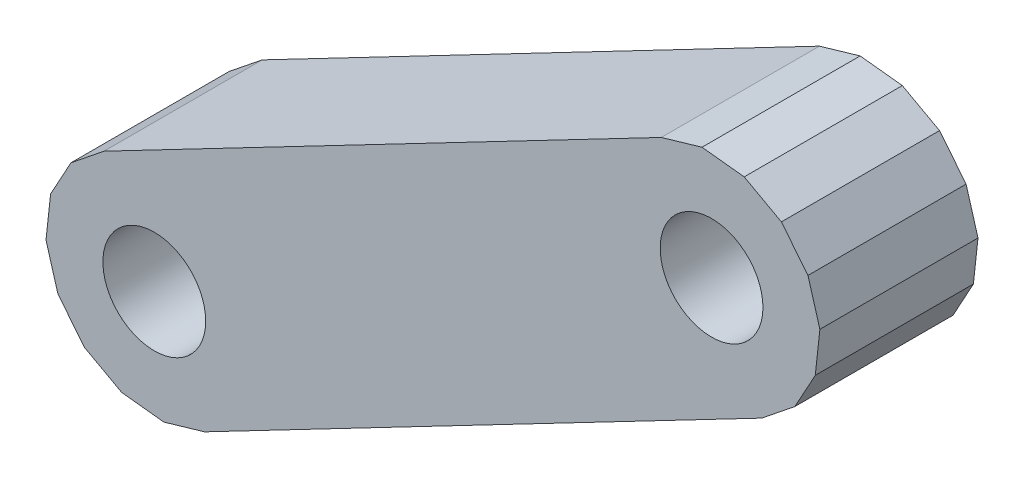
ISO-10303-21;
HEADER;
FILE_DESCRIPTION(('STEP AP214'),'2;1');
FILE_NAME('part.step','',(''),(''),'','','');
FILE_SCHEMA(('AUTOMOTIVE_DESIGN { 1 0 10303 214 1 1 1 1 }'));
ENDSEC;
DATA;
#1=APPLICATION_CONTEXT('core data for automotive mechanical design processes');
#2=APPLICATION_PROTOCOL_DEFINITION('international standard','automotive_design',2000,#1);
#3=PRODUCT_CONTEXT('',#1,'mechanical');
#4=PRODUCT('Part','Part','',(#3));
#5=PRODUCT_RELATED_PRODUCT_CATEGORY('part','',(#4));
#6=PRODUCT_DEFINITION_FORMATION('','',#4);
#7=PRODUCT_DEFINITION_CONTEXT('part definition',#1,'design');
#8=PRODUCT_DEFINITION('design','',#6,#7);
#9=PRODUCT_DEFINITION_SHAPE('','',#8);
#10=(LENGTH_UNIT() NAMED_UNIT(*) SI_UNIT(.MILLI.,.METRE.));
#11=(NAMED_UNIT(*) PLANE_ANGLE_UNIT() SI_UNIT($,.RADIAN.));
#12=(NAMED_UNIT(*) SI_UNIT($,.STERADIAN.) SOLID_ANGLE_UNIT());
#13=UNCERTAINTY_MEASURE_WITH_UNIT(LENGTH_MEASURE(1.E-05),#10,'distance_accuracy_value','');
#14=(GEOMETRIC_REPRESENTATION_CONTEXT(3) GLOBAL_UNCERTAINTY_ASSIGNED_CONTEXT((#13)) GLOBAL_UNIT_ASSIGNED_CONTEXT((#10,
#11,#12)) REPRESENTATION_CONTEXT('',''));
#15=CARTESIAN_POINT('',(0.,0.,0.));
#16=DIRECTION('',(0.,0.,1.));
#17=DIRECTION('',(1.,0.,0.));
#18=AXIS2_PLACEMENT_3D('',#15,#16,#17);
#19=CARTESIAN_POINT('',(15.5425925457675,21.1229903479481,8.));
#20=DIRECTION('',(-0.462289553775913,0.886729027645801,0.));
#21=DIRECTION('',(-0.886729027645801,-0.462289553775913,0.));
#22=AXIS2_PLACEMENT_3D('',#19,#20,#21);
#23=PLANE('',#22);
#24=DIRECTION('',(0.886729027645801,0.462289553775912,0.));
#25=VECTOR('',#24,1.);
#26=CARTESIAN_POINT('',(15.5425925457675,21.1229903479481,0.));
#27=LINE('',#26,#25);
#28=CARTESIAN_POINT('',(15.5425925457675,21.1229903479481,0.));
#29=VERTEX_POINT('',#28);
#30=CARTESIAN_POINT('',(43.7332020858087,35.8199540185028,0.));
#31=VERTEX_POINT('',#30);
#32=EDGE_CURVE('E195',#29,#31,#27,.T.);
#33=ORIENTED_EDGE('',*,*,#32,.T.);
#34=DIRECTION('',(0.,0.,-1.));
#35=VECTOR('',#34,1.);
#36=CARTESIAN_POINT('',(43.7332020858087,35.8199540185028,8.));
#37=LINE('',#36,#35);
#38=CARTESIAN_POINT('',(43.7332020858087,35.8199540185028,8.));
#39=VERTEX_POINT('',#38);
#40=EDGE_CURVE('E11',#39,#31,#37,.T.);
#41=ORIENTED_EDGE('',*,*,#40,.F.);
#42=DIRECTION('',(0.886729027645801,0.462289553775912,0.));
#43=VECTOR('',#42,1.);
#44=CARTESIAN_POINT('',(15.5425925457675,21.1229903479481,8.));
#45=LINE('',#44,#43);
#46=CARTESIAN_POINT('',(15.5425925457675,21.1229903479481,8.));
#47=VERTEX_POINT('',#46);
#48=EDGE_CURVE('E230',#47,#39,#45,.T.);
#49=ORIENTED_EDGE('',*,*,#48,.F.);
#50=DIRECTION('',(0.,0.,-1.));
#51=VECTOR('',#50,1.);
#52=CARTESIAN_POINT('',(15.5425925457675,21.1229903479481,8.));
#53=LINE('',#52,#51);
#54=EDGE_CURVE('E191',#47,#29,#53,.T.);
#55=ORIENTED_EDGE('',*,*,#54,.T.);
#56=EDGE_LOOP('',(#33,#41,#49,#55));
#57=FACE_BOUND('',#56,.T.);
#58=ADVANCED_FACE('F39',(#57),#23,.F.);
#59=CARTESIAN_POINT('',(43.7332020858087,35.8199540185028,8.));
#60=DIRECTION('',(-0.62639904117206,0.779502560110436,0.));
#61=DIRECTION('',(-0.779502560110436,-0.62639904117206,0.));
#62=AXIS2_PLACEMENT_3D('',#59,#60,#61);
#63=PLANE('',#62);
#64=DIRECTION('',(0.779502560110436,0.62639904117206,0.));
#65=VECTOR('',#64,1.);
#66=CARTESIAN_POINT('',(43.7332020858087,35.8199540185028,0.));
#67=LINE('',#66,#65);
#68=CARTESIAN_POINT('',(45.4060095459165,37.1642023156842,0.));
#69=VERTEX_POINT('',#68);
#70=EDGE_CURVE('E198',#31,#69,#67,.T.);
#71=ORIENTED_EDGE('',*,*,#70,.T.);
#72=DIRECTION('',(0.,0.,-1.));
#73=VECTOR('',#72,1.);
#74=CARTESIAN_POINT('',(45.4060095459165,37.1642023156842,8.));
#75=LINE('',#74,#73);
#76=CARTESIAN_POINT('',(45.4060095459165,37.1642023156842,8.));
#77=VERTEX_POINT('',#76);
#78=EDGE_CURVE('E47',#77,#69,#75,.T.);
#79=ORIENTED_EDGE('',*,*,#78,.F.);
#80=DIRECTION('',(0.779502560110436,0.62639904117206,0.));
#81=VECTOR('',#80,1.);
#82=CARTESIAN_POINT('',(43.7332020858087,35.8199540185028,8.));
#83=LINE('',#82,#81);
#84=EDGE_CURVE('E128',#39,#77,#83,.T.);
#85=ORIENTED_EDGE('',*,*,#84,.F.);
#86=ORIENTED_EDGE('',*,*,#40,.T.);
#87=EDGE_LOOP('',(#71,#79,#85,#86));
#88=FACE_BOUND('',#87,.T.);
#89=ADVANCED_FACE('F339',(#88),#63,.F.);
#90=CARTESIAN_POINT('',(45.4060095459165,37.1642023156842,8.));
#91=DIRECTION('',(-0.877019968563997,0.480453925720257,0.));
#92=DIRECTION('',(-0.480453925720257,-0.877019968563997,0.));
#93=AXIS2_PLACEMENT_3D('',#90,#91,#92);
#94=PLANE('',#93);
#95=DIRECTION('',(0.480453925720257,0.877019968563996,0.));
#96=VECTOR('',#95,1.);
#97=CARTESIAN_POINT('',(45.4060095459165,37.1642023156842,0.));
#98=LINE('',#97,#96);
#99=CARTESIAN_POINT('',(46.4370605678259,39.0462815045831,0.));
#100=VERTEX_POINT('',#99);
#101=EDGE_CURVE('E201',#69,#100,#98,.T.);
#102=ORIENTED_EDGE('',*,*,#101,.T.);
#103=DIRECTION('',(0.,0.,-1.));
#104=VECTOR('',#103,1.);
#105=CARTESIAN_POINT('',(46.4370605678259,39.0462815045831,8.));
#106=LINE('',#105,#104);
#107=CARTESIAN_POINT('',(46.4370605678259,39.0462815045831,8.));
#108=VERTEX_POINT('',#107);
#109=EDGE_CURVE('E267',#108,#100,#106,.T.);
#110=ORIENTED_EDGE('',*,*,#109,.F.);
#111=DIRECTION('',(0.480453925720257,0.877019968563996,0.));
#112=VECTOR('',#111,1.);
#113=CARTESIAN_POINT('',(45.4060095459165,37.1642023156842,8.));
#114=LINE('',#113,#112);
#115=EDGE_CURVE('E275',#77,#108,#114,.T.);
#116=ORIENTED_EDGE('',*,*,#115,.F.);
#117=ORIENTED_EDGE('',*,*,#78,.T.);
#118=EDGE_LOOP('',(#102,#110,#116,#117));
#119=FACE_BOUND('',#118,.T.);
#120=ADVANCED_FACE('F273',(#119),#94,.F.);
#121=CARTESIAN_POINT('',(46.4370605678259,39.0462815045831,8.));
#122=DIRECTION('',(-0.994122555947879,0.108260536464849,0.));
#123=DIRECTION('',(-0.108260536464849,-0.994122555947879,0.));
#124=AXIS2_PLACEMENT_3D('',#121,#122,#123);
#125=PLANE('',#124);
#126=DIRECTION('',(0.108260536464849,0.994122555947878,0.));
#127=VECTOR('',#126,1.);
#128=CARTESIAN_POINT('',(46.4370605678259,39.0462815045831,0.));
#129=LINE('',#128,#127);
#130=CARTESIAN_POINT('',(46.6693869799522,41.1796620897802,0.));
#131=VERTEX_POINT('',#130);
#132=EDGE_CURVE('E203',#100,#131,#129,.T.);
#133=ORIENTED_EDGE('',*,*,#132,.T.);
#134=DIRECTION('',(0.,0.,-1.));
#135=VECTOR('',#134,1.);
#136=CARTESIAN_POINT('',(46.6693869799522,41.1796620897802,8.));
#137=LINE('',#136,#135);
#138=CARTESIAN_POINT('',(46.6693869799522,41.1796620897802,8.));
#139=VERTEX_POINT('',#138);
#140=EDGE_CURVE('E264',#139,#131,#137,.T.);
#141=ORIENTED_EDGE('',*,*,#140,.F.);
#142=DIRECTION('',(0.108260536464849,0.994122555947878,0.));
#143=VECTOR('',#142,1.);
#144=CARTESIAN_POINT('',(46.4370605678259,39.0462815045831,8.));
#145=LINE('',#144,#143);
#146=EDGE_CURVE('E293',#108,#139,#145,.T.);
#147=ORIENTED_EDGE('',*,*,#146,.F.);
#148=ORIENTED_EDGE('',*,*,#109,.T.);
#149=EDGE_LOOP('',(#133,#141,#147,#148));
#150=FACE_BOUND('',#149,.T.);
#151=ADVANCED_FACE('F284',(#150),#125,.F.);
#152=CARTESIAN_POINT('',(46.6693869799522,41.1796620897802,8.));
#153=DIRECTION('',(-0.959878995932105,-0.280414538083129,0.));
#154=DIRECTION('',(0.280414538083129,-0.959878995932105,0.));
#155=AXIS2_PLACEMENT_3D('',#152,#153,#154);
#156=PLANE('',#155);
#157=DIRECTION('',(-0.280414538083129,0.959878995932105,0.));
#158=VECTOR('',#157,1.);
#159=CARTESIAN_POINT('',(46.6693869799522,41.1796620897802,0.));
#160=LINE('',#159,#158);
#161=CARTESIAN_POINT('',(46.0676191920931,43.2395562163222,0.));
#162=VERTEX_POINT('',#161);
#163=EDGE_CURVE('E205',#131,#162,#160,.T.);
#164=ORIENTED_EDGE('',*,*,#163,.T.);
#165=DIRECTION('',(0.,0.,-1.));
#166=VECTOR('',#165,1.);
#167=CARTESIAN_POINT('',(46.0676191920931,43.2395562163222,8.));
#168=LINE('',#167,#166);
#169=CARTESIAN_POINT('',(46.0676191920931,43.2395562163222,8.));
#170=VERTEX_POINT('',#169);
#171=EDGE_CURVE('E261',#170,#162,#168,.T.);
#172=ORIENTED_EDGE('',*,*,#171,.F.);
#173=DIRECTION('',(-0.280414538083129,0.959878995932105,0.));
#174=VECTOR('',#173,1.);
#175=CARTESIAN_POINT('',(46.6693869799522,41.1796620897802,8.));
#176=LINE('',#175,#174);
#177=EDGE_CURVE('E290',#139,#170,#176,.T.);
#178=ORIENTED_EDGE('',*,*,#177,.F.);
#179=ORIENTED_EDGE('',*,*,#140,.T.);
#180=EDGE_LOOP('',(#164,#172,#178,#179));
#181=FACE_BOUND('',#180,.T.);
#182=ADVANCED_FACE('F288',(#181),#156,.F.);
#183=CARTESIAN_POINT('',(46.0676191920931,43.2395562163222,8.));
#184=DIRECTION('',(-0.779502560110438,-0.626399041172058,0.));
#185=DIRECTION('',(0.626399041172058,-0.779502560110438,0.));
#186=AXIS2_PLACEMENT_3D('',#183,#184,#185);
#187=PLANE('',#186);
#188=DIRECTION('',(-0.626399041172058,0.779502560110438,0.));
#189=VECTOR('',#188,1.);
#190=CARTESIAN_POINT('',(46.0676191920931,43.2395562163222,0.));
#191=LINE('',#190,#189);
#192=CARTESIAN_POINT('',(44.7233708949118,44.91236367643,0.));
#193=VERTEX_POINT('',#192);
#194=EDGE_CURVE('E207',#162,#193,#191,.T.);
#195=ORIENTED_EDGE('',*,*,#194,.T.);
#196=DIRECTION('',(0.,0.,-1.));
#197=VECTOR('',#196,1.);
#198=CARTESIAN_POINT('',(44.7233708949118,44.91236367643,8.));
#199=LINE('',#198,#197);
#200=CARTESIAN_POINT('',(44.7233708949118,44.91236367643,8.));
#201=VERTEX_POINT('',#200);
#202=EDGE_CURVE('E258',#201,#193,#199,.T.);
#203=ORIENTED_EDGE('',*,*,#202,.F.);
#204=DIRECTION('',(-0.626399041172058,0.779502560110438,0.));
#205=VECTOR('',#204,1.);
#206=CARTESIAN_POINT('',(46.0676191920931,43.2395562163222,8.));
#207=LINE('',#206,#205);
#208=EDGE_CURVE('E292',#170,#201,#207,.T.);
#209=ORIENTED_EDGE('',*,*,#208,.F.);
#210=ORIENTED_EDGE('',*,*,#171,.T.);
#211=EDGE_LOOP('',(#195,#203,#209,#210));
#212=FACE_BOUND('',#211,.T.);
#213=ADVANCED_FACE('F352',(#212),#187,.F.);
#214=CARTESIAN_POINT('',(44.7233708949118,44.91236367643,8.));
#215=DIRECTION('',(-0.480453925720253,-0.877019968563999,0.));
#216=DIRECTION('',(0.877019968563999,-0.480453925720253,0.));
#217=AXIS2_PLACEMENT_3D('',#214,#215,#216);
#218=PLANE('',#217);
#219=DIRECTION('',(-0.877019968563999,0.480453925720253,0.));
#220=VECTOR('',#219,1.);
#221=CARTESIAN_POINT('',(44.7233708949118,44.91236367643,0.));
#222=LINE('',#221,#220);
#223=CARTESIAN_POINT('',(42.8412917060128,45.9434146983394,0.));
#224=VERTEX_POINT('',#223);
#225=EDGE_CURVE('E209',#193,#224,#222,.T.);
#226=ORIENTED_EDGE('',*,*,#225,.T.);
#227=DIRECTION('',(0.,0.,-1.));
#228=VECTOR('',#227,1.);
#229=CARTESIAN_POINT('',(42.8412917060128,45.9434146983394,8.));
#230=LINE('',#229,#228);
#231=CARTESIAN_POINT('',(42.8412917060128,45.9434146983394,8.));
#232=VERTEX_POINT('',#231);
#233=EDGE_CURVE('E255',#232,#224,#230,.T.);
#234=ORIENTED_EDGE('',*,*,#233,.F.);
#235=DIRECTION('',(-0.877019968563999,0.480453925720253,0.));
#236=VECTOR('',#235,1.);
#237=CARTESIAN_POINT('',(44.7233708949118,44.91236367643,8.));
#238=LINE('',#237,#236);
#239=EDGE_CURVE('E295',#201,#232,#238,.T.);
#240=ORIENTED_EDGE('',*,*,#239,.F.);
#241=ORIENTED_EDGE('',*,*,#202,.T.);
#242=EDGE_LOOP('',(#226,#234,#240,#241));
#243=FACE_BOUND('',#242,.T.);
#244=ADVANCED_FACE('F355',(#243),#218,.F.);
#245=CARTESIAN_POINT('',(42.8412917060128,45.9434146983394,8.));
#246=DIRECTION('',(-0.108260536464849,-0.994122555947879,0.));
#247=DIRECTION('',(0.994122555947879,-0.108260536464849,0.));
#248=AXIS2_PLACEMENT_3D('',#245,#246,#247);
#249=PLANE('',#248);
#250=DIRECTION('',(-0.994122555947879,0.108260536464849,0.));
#251=VECTOR('',#250,1.);
#252=CARTESIAN_POINT('',(42.8412917060128,45.9434146983394,0.));
#253=LINE('',#252,#251);
#254=CARTESIAN_POINT('',(40.7079111208157,46.1757411104657,0.));
#255=VERTEX_POINT('',#254);
#256=EDGE_CURVE('E211',#224,#255,#253,.T.);
#257=ORIENTED_EDGE('',*,*,#256,.T.);
#258=DIRECTION('',(0.,0.,-1.));
#259=VECTOR('',#258,1.);
#260=CARTESIAN_POINT('',(40.7079111208157,46.1757411104657,8.));
#261=LINE('',#260,#259);
#262=CARTESIAN_POINT('',(40.7079111208157,46.1757411104657,8.));
#263=VERTEX_POINT('',#262);
#264=EDGE_CURVE('E252',#263,#255,#261,.T.);
#265=ORIENTED_EDGE('',*,*,#264,.F.);
#266=DIRECTION('',(-0.994122555947879,0.108260536464849,0.));
#267=VECTOR('',#266,1.);
#268=CARTESIAN_POINT('',(42.8412917060128,45.9434146983394,8.));
#269=LINE('',#268,#267);
#270=EDGE_CURVE('E301',#232,#263,#269,.T.);
#271=ORIENTED_EDGE('',*,*,#270,.F.);
#272=ORIENTED_EDGE('',*,*,#233,.T.);
#273=EDGE_LOOP('',(#257,#265,#271,#272));
#274=FACE_BOUND('',#273,.T.);
#275=ADVANCED_FACE('F359',(#274),#249,.F.);
#276=CARTESIAN_POINT('',(40.7079111208157,46.1757411104657,8.));
#277=DIRECTION('',(0.280414538083126,-0.959878995932105,0.));
#278=DIRECTION('',(0.959878995932105,0.280414538083126,0.));
#279=AXIS2_PLACEMENT_3D('',#276,#277,#278);
#280=PLANE('',#279);
#281=DIRECTION('',(-0.959878995932105,-0.280414538083126,0.));
#282=VECTOR('',#281,1.);
#283=CARTESIAN_POINT('',(40.7079111208157,46.1757411104657,0.));
#284=LINE('',#283,#282);
#285=CARTESIAN_POINT('',(38.6480169942737,45.5739733226066,0.));
#286=VERTEX_POINT('',#285);
#287=EDGE_CURVE('E213',#255,#286,#284,.T.);
#288=ORIENTED_EDGE('',*,*,#287,.T.);
#289=DIRECTION('',(0.,0.,-1.));
#290=VECTOR('',#289,1.);
#291=CARTESIAN_POINT('',(38.6480169942737,45.5739733226066,8.));
#292=LINE('',#291,#290);
#293=CARTESIAN_POINT('',(38.6480169942737,45.5739733226066,8.));
#294=VERTEX_POINT('',#293);
#295=EDGE_CURVE('E249',#294,#286,#292,.T.);
#296=ORIENTED_EDGE('',*,*,#295,.F.);
#297=DIRECTION('',(-0.959878995932105,-0.280414538083126,0.));
#298=VECTOR('',#297,1.);
#299=CARTESIAN_POINT('',(40.7079111208157,46.1757411104657,8.));
#300=LINE('',#299,#298);
#301=EDGE_CURVE('E303',#263,#294,#300,.T.);
#302=ORIENTED_EDGE('',*,*,#301,.F.);
#303=ORIENTED_EDGE('',*,*,#264,.T.);
#304=EDGE_LOOP('',(#288,#296,#302,#303));
#305=FACE_BOUND('',#304,.T.);
#306=ADVANCED_FACE('F363',(#305),#280,.F.);
#307=CARTESIAN_POINT('',(38.6480169942737,45.5739733226066,8.));
#308=DIRECTION('',(0.462289553775912,-0.886729027645801,0.));
#309=DIRECTION('',(0.886729027645801,0.462289553775912,0.));
#310=AXIS2_PLACEMENT_3D('',#307,#308,#309);
#311=PLANE('',#310);
#312=DIRECTION('',(-0.886729027645801,-0.462289553775912,0.));
#313=VECTOR('',#312,1.);
#314=CARTESIAN_POINT('',(38.6480169942737,45.5739733226066,0.));
#315=LINE('',#314,#313);
#316=CARTESIAN_POINT('',(10.4574074542325,30.8770096520519,0.));
#317=VERTEX_POINT('',#316);
#318=EDGE_CURVE('E215',#286,#317,#315,.T.);
#319=ORIENTED_EDGE('',*,*,#318,.T.);
#320=DIRECTION('',(0.,0.,-1.));
#321=VECTOR('',#320,1.);
#322=CARTESIAN_POINT('',(10.4574074542325,30.8770096520519,8.));
#323=LINE('',#322,#321);
#324=CARTESIAN_POINT('',(10.4574074542325,30.8770096520519,8.));
#325=VERTEX_POINT('',#324);
#326=EDGE_CURVE('E246',#325,#317,#323,.T.);
#327=ORIENTED_EDGE('',*,*,#326,.F.);
#328=DIRECTION('',(-0.886729027645801,-0.462289553775912,0.));
#329=VECTOR('',#328,1.);
#330=CARTESIAN_POINT('',(38.6480169942737,45.5739733226066,8.));
#331=LINE('',#330,#329);
#332=EDGE_CURVE('E305',#294,#325,#331,.T.);
#333=ORIENTED_EDGE('',*,*,#332,.F.);
#334=ORIENTED_EDGE('',*,*,#295,.T.);
#335=EDGE_LOOP('',(#319,#327,#333,#334));
#336=FACE_BOUND('',#335,.T.);
#337=ADVANCED_FACE('F367',(#336),#311,.F.);
#338=CARTESIAN_POINT('',(10.4574074542325,30.8770096520519,8.));
#339=DIRECTION('',(0.62639904117206,-0.779502560110436,0.));
#340=DIRECTION('',(0.779502560110436,0.62639904117206,0.));
#341=AXIS2_PLACEMENT_3D('',#338,#339,#340);
#342=PLANE('',#341);
#343=DIRECTION('',(-0.779502560110436,-0.62639904117206,0.));
#344=VECTOR('',#343,1.);
#345=CARTESIAN_POINT('',(10.4574074542325,30.8770096520519,0.));
#346=LINE('',#345,#344);
#347=CARTESIAN_POINT('',(8.78459999412473,29.5327613548705,0.));
#348=VERTEX_POINT('',#347);
#349=EDGE_CURVE('E217',#317,#348,#346,.T.);
#350=ORIENTED_EDGE('',*,*,#349,.T.);
#351=DIRECTION('',(0.,0.,-1.));
#352=VECTOR('',#351,1.);
#353=CARTESIAN_POINT('',(8.78459999412473,29.5327613548705,8.));
#354=LINE('',#353,#352);
#355=CARTESIAN_POINT('',(8.78459999412473,29.5327613548705,8.));
#356=VERTEX_POINT('',#355);
#357=EDGE_CURVE('E243',#356,#348,#354,.T.);
#358=ORIENTED_EDGE('',*,*,#357,.F.);
#359=DIRECTION('',(-0.779502560110436,-0.62639904117206,0.));
#360=VECTOR('',#359,1.);
#361=CARTESIAN_POINT('',(10.4574074542325,30.8770096520519,8.));
#362=LINE('',#361,#360);
#363=EDGE_CURVE('E307',#325,#356,#362,.T.);
#364=ORIENTED_EDGE('',*,*,#363,.F.);
#365=ORIENTED_EDGE('',*,*,#326,.T.);
#366=EDGE_LOOP('',(#350,#358,#364,#365));
#367=FACE_BOUND('',#366,.T.);
#368=ADVANCED_FACE('F371',(#367),#342,.F.);
#369=CARTESIAN_POINT('',(8.78459999412473,29.5327613548705,8.));
#370=DIRECTION('',(0.877019968563997,-0.480453925720256,0.));
#371=DIRECTION('',(0.480453925720256,0.877019968563997,0.));
#372=AXIS2_PLACEMENT_3D('',#369,#370,#371);
#373=PLANE('',#372);
#374=DIRECTION('',(-0.480453925720256,-0.877019968563997,0.));
#375=VECTOR('',#374,1.);
#376=CARTESIAN_POINT('',(8.78459999412473,29.5327613548705,0.));
#377=LINE('',#376,#375);
#378=CARTESIAN_POINT('',(7.75354897221527,27.6506821659716,0.));
#379=VERTEX_POINT('',#378);
#380=EDGE_CURVE('E219',#348,#379,#377,.T.);
#381=ORIENTED_EDGE('',*,*,#380,.T.);
#382=DIRECTION('',(0.,0.,-1.));
#383=VECTOR('',#382,1.);
#384=CARTESIAN_POINT('',(7.75354897221527,27.6506821659716,8.));
#385=LINE('',#384,#383);
#386=CARTESIAN_POINT('',(7.75354897221527,27.6506821659716,8.));
#387=VERTEX_POINT('',#386);
#388=EDGE_CURVE('E240',#387,#379,#385,.T.);
#389=ORIENTED_EDGE('',*,*,#388,.F.);
#390=DIRECTION('',(-0.480453925720256,-0.877019968563997,0.));
#391=VECTOR('',#390,1.);
#392=CARTESIAN_POINT('',(8.78459999412473,29.5327613548705,8.));
#393=LINE('',#392,#391);
#394=EDGE_CURVE('E309',#356,#387,#393,.T.);
#395=ORIENTED_EDGE('',*,*,#394,.F.);
#396=ORIENTED_EDGE('',*,*,#357,.T.);
#397=EDGE_LOOP('',(#381,#389,#395,#396));
#398=FACE_BOUND('',#397,.T.);
#399=ADVANCED_FACE('F375',(#398),#373,.F.);
#400=CARTESIAN_POINT('',(7.75354897221527,27.6506821659716,8.));
#401=DIRECTION('',(0.994122555947879,-0.108260536464849,0.));
#402=DIRECTION('',(0.108260536464849,0.994122555947879,0.));
#403=AXIS2_PLACEMENT_3D('',#400,#401,#402);
#404=PLANE('',#403);
#405=DIRECTION('',(-0.108260536464849,-0.994122555947878,0.));
#406=VECTOR('',#405,1.);
#407=CARTESIAN_POINT('',(7.75354897221527,27.6506821659716,0.));
#408=LINE('',#407,#406);
#409=CARTESIAN_POINT('',(7.52122256008905,25.5173015807745,0.));
#410=VERTEX_POINT('',#409);
#411=EDGE_CURVE('E221',#379,#410,#408,.T.);
#412=ORIENTED_EDGE('',*,*,#411,.T.);
#413=DIRECTION('',(0.,0.,-1.));
#414=VECTOR('',#413,1.);
#415=CARTESIAN_POINT('',(7.52122256008905,25.5173015807745,8.));
#416=LINE('',#415,#414);
#417=CARTESIAN_POINT('',(7.52122256008905,25.5173015807745,8.));
#418=VERTEX_POINT('',#417);
#419=EDGE_CURVE('E237',#418,#410,#416,.T.);
#420=ORIENTED_EDGE('',*,*,#419,.F.);
#421=DIRECTION('',(-0.108260536464849,-0.994122555947878,0.));
#422=VECTOR('',#421,1.);
#423=CARTESIAN_POINT('',(7.75354897221527,27.6506821659716,8.));
#424=LINE('',#423,#422);
#425=EDGE_CURVE('E311',#387,#418,#424,.T.);
#426=ORIENTED_EDGE('',*,*,#425,.F.);
#427=ORIENTED_EDGE('',*,*,#388,.T.);
#428=EDGE_LOOP('',(#412,#420,#426,#427));
#429=FACE_BOUND('',#428,.T.);
#430=ADVANCED_FACE('F379',(#429),#404,.F.);
#431=CARTESIAN_POINT('',(7.52122256008905,25.5173015807745,8.));
#432=DIRECTION('',(0.959878995932106,0.280414538083125,0.));
#433=DIRECTION('',(-0.280414538083125,0.959878995932106,0.));
#434=AXIS2_PLACEMENT_3D('',#431,#432,#433);
#435=PLANE('',#434);
#436=DIRECTION('',(0.280414538083125,-0.959878995932106,0.));
#437=VECTOR('',#436,1.);
#438=CARTESIAN_POINT('',(7.52122256008905,25.5173015807745,0.));
#439=LINE('',#438,#437);
#440=CARTESIAN_POINT('',(8.12299034794809,23.4574074542325,0.));
#441=VERTEX_POINT('',#440);
#442=EDGE_CURVE('E223',#410,#441,#439,.T.);
#443=ORIENTED_EDGE('',*,*,#442,.T.);
#444=DIRECTION('',(0.,0.,-1.));
#445=VECTOR('',#444,1.);
#446=CARTESIAN_POINT('',(8.12299034794809,23.4574074542325,8.));
#447=LINE('',#446,#445);
#448=CARTESIAN_POINT('',(8.12299034794809,23.4574074542325,8.));
#449=VERTEX_POINT('',#448);
#450=EDGE_CURVE('E234',#449,#441,#447,.T.);
#451=ORIENTED_EDGE('',*,*,#450,.F.);
#452=DIRECTION('',(0.280414538083125,-0.959878995932106,0.));
#453=VECTOR('',#452,1.);
#454=CARTESIAN_POINT('',(7.52122256008905,25.5173015807745,8.));
#455=LINE('',#454,#453);
#456=EDGE_CURVE('E313',#418,#449,#455,.T.);
#457=ORIENTED_EDGE('',*,*,#456,.F.);
#458=ORIENTED_EDGE('',*,*,#419,.T.);
#459=EDGE_LOOP('',(#443,#451,#457,#458));
#460=FACE_BOUND('',#459,.T.);
#461=ADVANCED_FACE('F319',(#460),#435,.F.);
#462=CARTESIAN_POINT('',(8.12299034794809,23.4574074542325,8.));
#463=DIRECTION('',(0.779502560110436,0.62639904117206,0.));
#464=DIRECTION('',(-0.62639904117206,0.779502560110436,0.));
#465=AXIS2_PLACEMENT_3D('',#462,#463,#464);
#466=PLANE('',#465);
#467=DIRECTION('',(0.62639904117206,-0.779502560110436,0.));
#468=VECTOR('',#467,1.);
#469=CARTESIAN_POINT('',(8.12299034794809,23.4574074542325,0.));
#470=LINE('',#469,#468);
#471=CARTESIAN_POINT('',(9.46723864512946,21.7845999941247,0.));
#472=VERTEX_POINT('',#471);
#473=EDGE_CURVE('E225',#441,#472,#470,.T.);
#474=ORIENTED_EDGE('',*,*,#473,.T.);
#475=DIRECTION('',(0.,0.,-1.));
#476=VECTOR('',#475,1.);
#477=CARTESIAN_POINT('',(9.46723864512946,21.7845999941247,8.));
#478=LINE('',#477,#476);
#479=CARTESIAN_POINT('',(9.46723864512946,21.7845999941247,8.));
#480=VERTEX_POINT('',#479);
#481=EDGE_CURVE('E186',#480,#472,#478,.T.);
#482=ORIENTED_EDGE('',*,*,#481,.F.);
#483=DIRECTION('',(0.62639904117206,-0.779502560110436,0.));
#484=VECTOR('',#483,1.);
#485=CARTESIAN_POINT('',(8.12299034794809,23.4574074542325,8.));
#486=LINE('',#485,#484);
#487=EDGE_CURVE('E177',#449,#480,#486,.T.);
#488=ORIENTED_EDGE('',*,*,#487,.F.);
#489=ORIENTED_EDGE('',*,*,#450,.T.);
#490=EDGE_LOOP('',(#474,#482,#488,#489));
#491=FACE_BOUND('',#490,.T.);
#492=ADVANCED_FACE('F323',(#491),#466,.F.);
#493=CARTESIAN_POINT('',(9.46723864512946,21.7845999941247,8.));
#494=DIRECTION('',(0.480453925720257,0.877019968563997,0.));
#495=DIRECTION('',(-0.877019968563997,0.480453925720257,0.));
#496=AXIS2_PLACEMENT_3D('',#493,#494,#495);
#497=PLANE('',#496);
#498=DIRECTION('',(0.877019968563997,-0.480453925720257,0.));
#499=VECTOR('',#498,1.);
#500=CARTESIAN_POINT('',(9.46723864512946,21.7845999941247,0.));
#501=LINE('',#500,#499);
#502=CARTESIAN_POINT('',(11.3493178340284,20.7535489722153,0.));
#503=VERTEX_POINT('',#502);
#504=EDGE_CURVE('E185',#472,#503,#501,.T.);
#505=ORIENTED_EDGE('',*,*,#504,.T.);
#506=DIRECTION('',(0.,0.,-1.));
#507=VECTOR('',#506,1.);
#508=CARTESIAN_POINT('',(11.3493178340284,20.7535489722153,8.));
#509=LINE('',#508,#507);
#510=CARTESIAN_POINT('',(11.3493178340284,20.7535489722153,8.));
#511=VERTEX_POINT('',#510);
#512=EDGE_CURVE('E182',#511,#503,#509,.T.);
#513=ORIENTED_EDGE('',*,*,#512,.F.);
#514=DIRECTION('',(0.877019968563997,-0.480453925720257,0.));
#515=VECTOR('',#514,1.);
#516=CARTESIAN_POINT('',(9.46723864512946,21.7845999941247,8.));
#517=LINE('',#516,#515);
#518=EDGE_CURVE('E171',#480,#511,#517,.T.);
#519=ORIENTED_EDGE('',*,*,#518,.F.);
#520=ORIENTED_EDGE('',*,*,#481,.T.);
#521=EDGE_LOOP('',(#505,#513,#519,#520));
#522=FACE_BOUND('',#521,.T.);
#523=ADVANCED_FACE('F183',(#522),#497,.F.);
#524=CARTESIAN_POINT('',(11.3493178340284,20.7535489722153,8.));
#525=DIRECTION('',(0.108260536464848,0.994122555947879,0.));
#526=DIRECTION('',(-0.994122555947879,0.108260536464848,0.));
#527=AXIS2_PLACEMENT_3D('',#524,#525,#526);
#528=PLANE('',#527);
#529=DIRECTION('',(0.994122555947879,-0.108260536464848,0.));
#530=VECTOR('',#529,1.);
#531=CARTESIAN_POINT('',(11.3493178340284,20.7535489722153,0.));
#532=LINE('',#531,#530);
#533=CARTESIAN_POINT('',(13.4826984192255,20.521222560089,0.));
#534=VERTEX_POINT('',#533);
#535=EDGE_CURVE('E114',#503,#534,#532,.T.);
#536=ORIENTED_EDGE('',*,*,#535,.T.);
#537=DIRECTION('',(0.,0.,-1.));
#538=VECTOR('',#537,1.);
#539=CARTESIAN_POINT('',(13.4826984192255,20.521222560089,8.));
#540=LINE('',#539,#538);
#541=CARTESIAN_POINT('',(13.4826984192255,20.521222560089,8.));
#542=VERTEX_POINT('',#541);
#543=EDGE_CURVE('E187',#542,#534,#540,.T.);
#544=ORIENTED_EDGE('',*,*,#543,.F.);
#545=DIRECTION('',(0.994122555947879,-0.108260536464848,0.));
#546=VECTOR('',#545,1.);
#547=CARTESIAN_POINT('',(11.3493178340284,20.7535489722153,8.));
#548=LINE('',#547,#546);
#549=EDGE_CURVE('E175',#511,#542,#548,.T.);
#550=ORIENTED_EDGE('',*,*,#549,.F.);
#551=ORIENTED_EDGE('',*,*,#512,.T.);
#552=EDGE_LOOP('',(#536,#544,#550,#551));
#553=FACE_BOUND('',#552,.T.);
#554=ADVANCED_FACE('F189',(#553),#528,.F.);
#555=CARTESIAN_POINT('',(13.4826984192255,20.521222560089,8.));
#556=DIRECTION('',(-0.280414538083123,0.959878995932106,0.));
#557=DIRECTION('',(-0.959878995932106,-0.280414538083123,0.));
#558=AXIS2_PLACEMENT_3D('',#555,#556,#557);
#559=PLANE('',#558);
#560=DIRECTION('',(0.959878995932106,0.280414538083123,0.));
#561=VECTOR('',#560,1.);
#562=CARTESIAN_POINT('',(13.4826984192255,20.521222560089,0.));
#563=LINE('',#562,#561);
#564=EDGE_CURVE('E120',#534,#29,#563,.T.);
#565=ORIENTED_EDGE('',*,*,#564,.T.);
#566=ORIENTED_EDGE('',*,*,#54,.F.);
#567=DIRECTION('',(0.959878995932106,0.280414538083123,0.));
#568=VECTOR('',#567,1.);
#569=CARTESIAN_POINT('',(13.4826984192255,20.521222560089,8.));
#570=LINE('',#569,#568);
#571=EDGE_CURVE('E55',#542,#47,#570,.T.);
#572=ORIENTED_EDGE('',*,*,#571,.F.);
#573=ORIENTED_EDGE('',*,*,#543,.T.);
#574=EDGE_LOOP('',(#565,#566,#572,#573));
#575=FACE_BOUND('',#574,.T.);
#576=ADVANCED_FACE('F327',(#575),#559,.F.);
#577=CARTESIAN_POINT('',(0.,0.,8.));
#578=DIRECTION('',(0.,0.,1.));
#579=DIRECTION('',(1.,0.,0.));
#580=AXIS2_PLACEMENT_3D('',#577,#578,#579);
#581=PLANE('',#580);
#582=CARTESIAN_POINT('',(13.,26.,8.));
#583=DIRECTION('',(0.,0.,1.));
#584=DIRECTION('',(1.,0.,0.));
#585=AXIS2_PLACEMENT_3D('',#582,#583,#584);
#586=CIRCLE('',#585,2.6);
#587=CARTESIAN_POINT('',(15.6,26.,8.));
#588=VERTEX_POINT('',#587);
#589=EDGE_CURVE('E575',#588,#588,#586,.T.);
#590=ORIENTED_EDGE('',*,*,#589,.F.);
#591=EDGE_LOOP('',(#590));
#592=FACE_BOUND('',#591,.T.);
#593=CARTESIAN_POINT('',(41.1906095400412,40.6969636705547,8.));
#594=DIRECTION('',(0.,0.,1.));
#595=DIRECTION('',(1.,0.,0.));
#596=AXIS2_PLACEMENT_3D('',#593,#594,#595);
#597=CIRCLE('',#596,2.6);
#598=CARTESIAN_POINT('',(43.7906095400412,40.6969636705547,8.));
#599=VERTEX_POINT('',#598);
#600=EDGE_CURVE('E577',#599,#599,#597,.T.);
#601=ORIENTED_EDGE('',*,*,#600,.F.);
#602=EDGE_LOOP('',(#601));
#603=FACE_BOUND('',#602,.T.);
#604=ORIENTED_EDGE('',*,*,#48,.T.);
#605=ORIENTED_EDGE('',*,*,#84,.T.);
#606=ORIENTED_EDGE('',*,*,#115,.T.);
#607=ORIENTED_EDGE('',*,*,#146,.T.);
#608=ORIENTED_EDGE('',*,*,#177,.T.);
#609=ORIENTED_EDGE('',*,*,#208,.T.);
#610=ORIENTED_EDGE('',*,*,#239,.T.);
#611=ORIENTED_EDGE('',*,*,#270,.T.);
#612=ORIENTED_EDGE('',*,*,#301,.T.);
#613=ORIENTED_EDGE('',*,*,#332,.T.);
#614=ORIENTED_EDGE('',*,*,#363,.T.);
#615=ORIENTED_EDGE('',*,*,#394,.T.);
#616=ORIENTED_EDGE('',*,*,#425,.T.);
#617=ORIENTED_EDGE('',*,*,#456,.T.);
#618=ORIENTED_EDGE('',*,*,#487,.T.);
#619=ORIENTED_EDGE('',*,*,#518,.T.);
#620=ORIENTED_EDGE('',*,*,#549,.T.);
#621=ORIENTED_EDGE('',*,*,#571,.T.);
#622=EDGE_LOOP('',(#604,#605,#606,#607,#608,#609,#610,#611,#612,#613,#614,#615,#616,#617,#618,
#619,#620,#621));
#623=FACE_BOUND('',#622,.T.);
#624=ADVANCED_FACE('F173',(#592,#603,#623),#581,.T.);
#625=CARTESIAN_POINT('',(0.,0.,0.));
#626=DIRECTION('',(0.,0.,1.));
#627=DIRECTION('',(1.,0.,0.));
#628=AXIS2_PLACEMENT_3D('',#625,#626,#627);
#629=PLANE('',#628);
#630=CARTESIAN_POINT('',(13.,26.,0.));
#631=DIRECTION('',(0.,0.,1.));
#632=DIRECTION('',(1.,0.,0.));
#633=AXIS2_PLACEMENT_3D('',#630,#631,#632);
#634=CIRCLE('',#633,2.6);
#635=CARTESIAN_POINT('',(15.6,26.,0.));
#636=VERTEX_POINT('',#635);
#637=EDGE_CURVE('E572',#636,#636,#634,.T.);
#638=ORIENTED_EDGE('',*,*,#637,.T.);
#639=EDGE_LOOP('',(#638));
#640=FACE_BOUND('',#639,.T.);
#641=CARTESIAN_POINT('',(41.1906095400412,40.6969636705547,0.));
#642=DIRECTION('',(0.,0.,1.));
#643=DIRECTION('',(1.,0.,0.));
#644=AXIS2_PLACEMENT_3D('',#641,#642,#643);
#645=CIRCLE('',#644,2.6);
#646=CARTESIAN_POINT('',(43.7906095400412,40.6969636705547,0.));
#647=VERTEX_POINT('',#646);
#648=EDGE_CURVE('E199',#647,#647,#645,.T.);
#649=ORIENTED_EDGE('',*,*,#648,.T.);
#650=EDGE_LOOP('',(#649));
#651=FACE_BOUND('',#650,.T.);
#652=ORIENTED_EDGE('',*,*,#32,.F.);
#653=ORIENTED_EDGE('',*,*,#564,.F.);
#654=ORIENTED_EDGE('',*,*,#535,.F.);
#655=ORIENTED_EDGE('',*,*,#504,.F.);
#656=ORIENTED_EDGE('',*,*,#473,.F.);
#657=ORIENTED_EDGE('',*,*,#442,.F.);
#658=ORIENTED_EDGE('',*,*,#411,.F.);
#659=ORIENTED_EDGE('',*,*,#380,.F.);
#660=ORIENTED_EDGE('',*,*,#349,.F.);
#661=ORIENTED_EDGE('',*,*,#318,.F.);
#662=ORIENTED_EDGE('',*,*,#287,.F.);
#663=ORIENTED_EDGE('',*,*,#256,.F.);
#664=ORIENTED_EDGE('',*,*,#225,.F.);
#665=ORIENTED_EDGE('',*,*,#194,.F.);
#666=ORIENTED_EDGE('',*,*,#163,.F.);
#667=ORIENTED_EDGE('',*,*,#132,.F.);
#668=ORIENTED_EDGE('',*,*,#101,.F.);
#669=ORIENTED_EDGE('',*,*,#70,.F.);
#670=EDGE_LOOP('',(#652,#653,#654,#655,#656,#657,#658,#659,#660,#661,#662,#663,#664,#665,#666,
#667,#668,#669));
#671=FACE_BOUND('',#670,.T.);
#672=ADVANCED_FACE('F279',(#640,#651,#671),#629,.F.);
#673=CARTESIAN_POINT('',(41.1906095400412,40.6969636705547,0.));
#674=DIRECTION('',(0.,0.,1.));
#675=DIRECTION('',(1.,0.,0.));
#676=AXIS2_PLACEMENT_3D('',#673,#674,#675);
#677=CYLINDRICAL_SURFACE('',#676,2.6);
#678=ORIENTED_EDGE('',*,*,#648,.F.);
#679=EDGE_LOOP('',(#678));
#680=FACE_BOUND('',#679,.T.);
#681=ORIENTED_EDGE('',*,*,#600,.T.);
#682=EDGE_LOOP('',(#681));
#683=FACE_BOUND('',#682,.T.);
#684=ADVANCED_FACE('F409',(#680,#683),#677,.F.);
#685=CARTESIAN_POINT('',(13.,26.,0.));
#686=DIRECTION('',(0.,0.,1.));
#687=DIRECTION('',(1.,0.,0.));
#688=AXIS2_PLACEMENT_3D('',#685,#686,#687);
#689=CYLINDRICAL_SURFACE('',#688,2.6);
#690=ORIENTED_EDGE('',*,*,#637,.F.);
#691=EDGE_LOOP('',(#690));
#692=FACE_BOUND('',#691,.T.);
#693=ORIENTED_EDGE('',*,*,#589,.T.);
#694=EDGE_LOOP('',(#693));
#695=FACE_BOUND('',#694,.T.);
#696=ADVANCED_FACE('F414',(#692,#695),#689,.F.);
#697=CLOSED_SHELL('',(#58,#89,#120,#151,#182,#213,#244,#275,#306,#337,#368,#399,#430,#461,#492,
#523,#554,#576,#624,#672,#684,#696));
#698=MANIFOLD_SOLID_BREP('B2',#697);
#699=ADVANCED_BREP_SHAPE_REPRESENTATION('',(#18,#698),#14);
#700=SHAPE_DEFINITION_REPRESENTATION(#9,#699);
ENDSEC;
END-ISO-10303-21;
